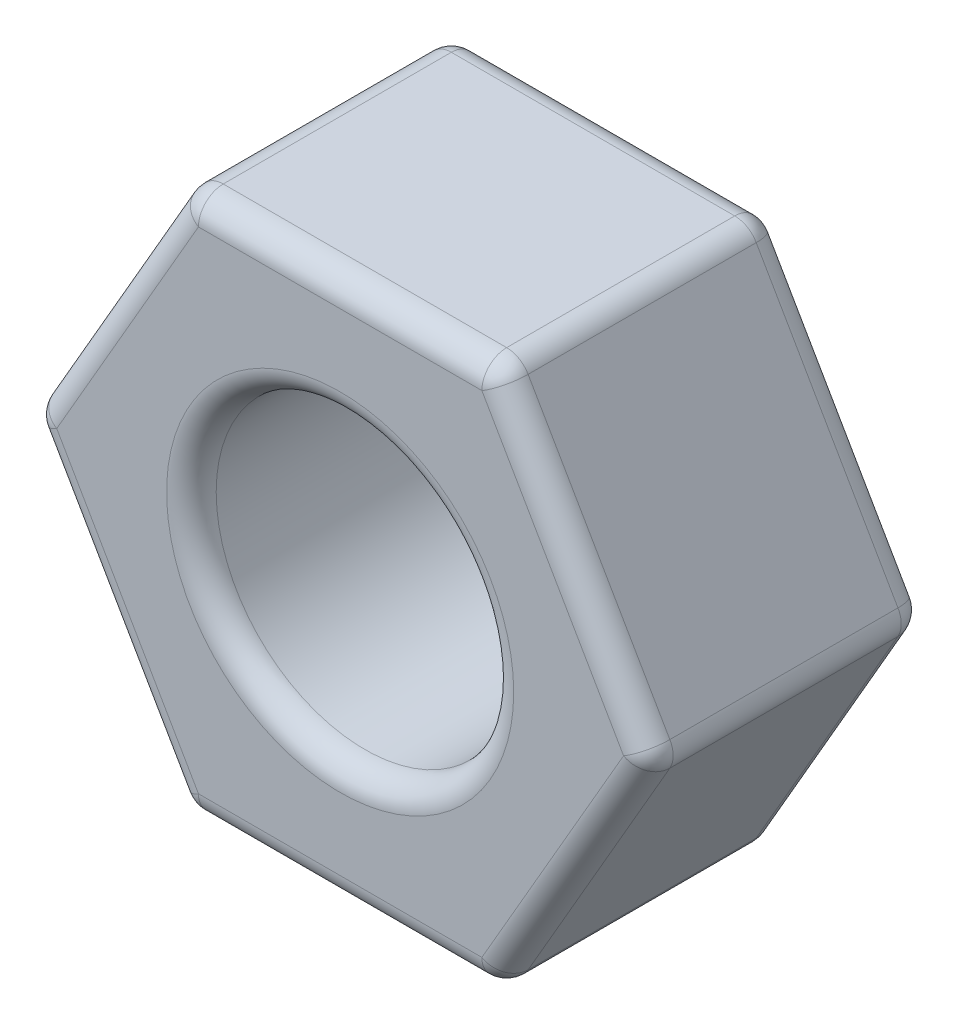
ISO-10303-21;
HEADER;
FILE_DESCRIPTION(('STEP AP214'),'2;1');
FILE_NAME('part.step','',(''),(''),'','','');
FILE_SCHEMA(('AUTOMOTIVE_DESIGN { 1 0 10303 214 1 1 1 1 }'));
ENDSEC;
DATA;
#1=APPLICATION_CONTEXT('core data for automotive mechanical design processes');
#2=APPLICATION_PROTOCOL_DEFINITION('international standard','automotive_design',2000,#1);
#3=PRODUCT_CONTEXT('',#1,'mechanical');
#4=PRODUCT('Part','Part','',(#3));
#5=PRODUCT_RELATED_PRODUCT_CATEGORY('part','',(#4));
#6=PRODUCT_DEFINITION_FORMATION('','',#4);
#7=PRODUCT_DEFINITION_CONTEXT('part definition',#1,'design');
#8=PRODUCT_DEFINITION('design','',#6,#7);
#9=PRODUCT_DEFINITION_SHAPE('','',#8);
#10=(LENGTH_UNIT() NAMED_UNIT(*) SI_UNIT(.MILLI.,.METRE.));
#11=(NAMED_UNIT(*) PLANE_ANGLE_UNIT() SI_UNIT($,.RADIAN.));
#12=(NAMED_UNIT(*) SI_UNIT($,.STERADIAN.) SOLID_ANGLE_UNIT());
#13=UNCERTAINTY_MEASURE_WITH_UNIT(LENGTH_MEASURE(1.E-05),#10,'distance_accuracy_value','');
#14=(GEOMETRIC_REPRESENTATION_CONTEXT(3) GLOBAL_UNCERTAINTY_ASSIGNED_CONTEXT((#13)) GLOBAL_UNIT_ASSIGNED_CONTEXT((#10,
#11,#12)) REPRESENTATION_CONTEXT('',''));
#15=CARTESIAN_POINT('',(0.,0.,0.));
#16=DIRECTION('',(0.,0.,1.));
#17=DIRECTION('',(1.,0.,0.));
#18=AXIS2_PLACEMENT_3D('',#15,#16,#17);
#19=CARTESIAN_POINT('',(0.,0.,5.6));
#20=DIRECTION('',(0.,0.,1.));
#21=DIRECTION('',(1.,0.,0.));
#22=AXIS2_PLACEMENT_3D('',#19,#20,#21);
#23=PLANE('',#22);
#24=CARTESIAN_POINT('',(0.,0.,5.6));
#25=DIRECTION('',(0.,0.,1.));
#26=DIRECTION('',(1.,0.,0.));
#27=AXIS2_PLACEMENT_3D('',#24,#25,#26);
#28=CIRCLE('',#27,3.5);
#29=CARTESIAN_POINT('',(3.5,0.,5.6));
#30=VERTEX_POINT('',#29);
#31=EDGE_CURVE('E11',#30,#30,#28,.F.);
#32=ORIENTED_EDGE('',*,*,#31,.T.);
#33=EDGE_LOOP('',(#32));
#34=FACE_BOUND('',#33,.T.);
#35=DIRECTION('',(-0.5,0.866025403784439,0.));
#36=VECTOR('',#35,1.);
#37=CARTESIAN_POINT('',(2.71354626519124,5.2,5.6));
#38=LINE('',#37,#36);
#39=CARTESIAN_POINT('',(5.71576766497729,0.,5.6));
#40=VERTEX_POINT('',#39);
#41=CARTESIAN_POINT('',(2.85788383248865,4.95,5.6));
#42=VERTEX_POINT('',#41);
#43=EDGE_CURVE('E60',#40,#42,#38,.T.);
#44=ORIENTED_EDGE('',*,*,#43,.T.);
#45=DIRECTION('',(-1.,0.,0.));
#46=VECTOR('',#45,1.);
#47=CARTESIAN_POINT('',(-3.14655896708346,4.95,5.6));
#48=LINE('',#47,#46);
#49=CARTESIAN_POINT('',(-2.85788383248865,4.95,5.6));
#50=VERTEX_POINT('',#49);
#51=EDGE_CURVE('E52',#42,#50,#48,.T.);
#52=ORIENTED_EDGE('',*,*,#51,.T.);
#53=DIRECTION('',(-0.5,-0.866025403784439,0.));
#54=VECTOR('',#53,1.);
#55=CARTESIAN_POINT('',(-5.8601052322747,-0.250000000000001,5.6));
#56=LINE('',#55,#54);
#57=CARTESIAN_POINT('',(-5.7157676649773,0.,5.6));
#58=VERTEX_POINT('',#57);
#59=EDGE_CURVE('E277',#50,#58,#56,.T.);
#60=ORIENTED_EDGE('',*,*,#59,.T.);
#61=DIRECTION('',(0.5,-0.866025403784439,0.));
#62=VECTOR('',#61,1.);
#63=CARTESIAN_POINT('',(-2.71354626519124,-5.2,5.6));
#64=LINE('',#63,#62);
#65=CARTESIAN_POINT('',(-2.85788383248865,-4.95,5.6));
#66=VERTEX_POINT('',#65);
#67=EDGE_CURVE('E279',#58,#66,#64,.T.);
#68=ORIENTED_EDGE('',*,*,#67,.T.);
#69=DIRECTION('',(1.,0.,0.));
#70=VECTOR('',#69,1.);
#71=CARTESIAN_POINT('',(3.14655896708346,-4.95,5.6));
#72=LINE('',#71,#70);
#73=CARTESIAN_POINT('',(2.85788383248865,-4.95,5.6));
#74=VERTEX_POINT('',#73);
#75=EDGE_CURVE('E281',#66,#74,#72,.T.);
#76=ORIENTED_EDGE('',*,*,#75,.T.);
#77=DIRECTION('',(0.5,0.866025403784439,0.));
#78=VECTOR('',#77,1.);
#79=CARTESIAN_POINT('',(5.8601052322747,0.250000000000002,5.6));
#80=LINE('',#79,#78);
#81=EDGE_CURVE('E65',#74,#40,#80,.T.);
#82=ORIENTED_EDGE('',*,*,#81,.T.);
#83=EDGE_LOOP('',(#44,#52,#60,#68,#76,#82));
#84=FACE_BOUND('',#83,.T.);
#85=ADVANCED_FACE('F43',(#34,#84),#23,.T.);
#86=CARTESIAN_POINT('',(0.,0.,0.));
#87=DIRECTION('',(0.,0.,1.));
#88=DIRECTION('',(1.,0.,0.));
#89=AXIS2_PLACEMENT_3D('',#86,#87,#88);
#90=PLANE('',#89);
#91=CARTESIAN_POINT('',(0.,0.,0.));
#92=DIRECTION('',(0.,0.,1.));
#93=DIRECTION('',(1.,0.,0.));
#94=AXIS2_PLACEMENT_3D('',#91,#92,#93);
#95=CIRCLE('',#94,3.5);
#96=CARTESIAN_POINT('',(3.5,0.,0.));
#97=VERTEX_POINT('',#96);
#98=EDGE_CURVE('E215',#97,#97,#95,.T.);
#99=ORIENTED_EDGE('',*,*,#98,.T.);
#100=EDGE_LOOP('',(#99));
#101=FACE_BOUND('',#100,.T.);
#102=DIRECTION('',(-0.5,0.866025403784439,0.));
#103=VECTOR('',#102,1.);
#104=CARTESIAN_POINT('',(4.28682574873297,2.475,0.));
#105=LINE('',#104,#103);
#106=CARTESIAN_POINT('',(2.85788383248865,4.95,0.));
#107=VERTEX_POINT('',#106);
#108=CARTESIAN_POINT('',(5.71576766497729,0.,0.));
#109=VERTEX_POINT('',#108);
#110=EDGE_CURVE('E179',#107,#109,#105,.F.);
#111=ORIENTED_EDGE('',*,*,#110,.T.);
#112=DIRECTION('',(0.5,0.866025403784439,0.));
#113=VECTOR('',#112,1.);
#114=CARTESIAN_POINT('',(4.28682574873297,-2.475,0.));
#115=LINE('',#114,#113);
#116=CARTESIAN_POINT('',(2.85788383248865,-4.95,0.));
#117=VERTEX_POINT('',#116);
#118=EDGE_CURVE('E212',#109,#117,#115,.F.);
#119=ORIENTED_EDGE('',*,*,#118,.T.);
#120=DIRECTION('',(1.,0.,0.));
#121=VECTOR('',#120,1.);
#122=CARTESIAN_POINT('',(0.,-4.95,0.));
#123=LINE('',#122,#121);
#124=CARTESIAN_POINT('',(-2.85788383248865,-4.95,0.));
#125=VERTEX_POINT('',#124);
#126=EDGE_CURVE('E210',#117,#125,#123,.F.);
#127=ORIENTED_EDGE('',*,*,#126,.T.);
#128=DIRECTION('',(0.5,-0.866025403784439,0.));
#129=VECTOR('',#128,1.);
#130=CARTESIAN_POINT('',(-4.28682574873297,-2.475,0.));
#131=LINE('',#130,#129);
#132=CARTESIAN_POINT('',(-5.71576766497729,0.,0.));
#133=VERTEX_POINT('',#132);
#134=EDGE_CURVE('E175',#125,#133,#131,.F.);
#135=ORIENTED_EDGE('',*,*,#134,.T.);
#136=DIRECTION('',(-0.5,-0.866025403784439,0.));
#137=VECTOR('',#136,1.);
#138=CARTESIAN_POINT('',(-4.28682574873297,2.475,0.));
#139=LINE('',#138,#137);
#140=CARTESIAN_POINT('',(-2.85788383248865,4.95,0.));
#141=VERTEX_POINT('',#140);
#142=EDGE_CURVE('E168',#133,#141,#139,.F.);
#143=ORIENTED_EDGE('',*,*,#142,.T.);
#144=DIRECTION('',(-1.,0.,0.));
#145=VECTOR('',#144,1.);
#146=CARTESIAN_POINT('',(0.,4.95,0.));
#147=LINE('',#146,#145);
#148=EDGE_CURVE('E172',#141,#107,#147,.F.);
#149=ORIENTED_EDGE('',*,*,#148,.T.);
#150=EDGE_LOOP('',(#111,#119,#127,#135,#143,#149));
#151=FACE_BOUND('',#150,.T.);
#152=ADVANCED_FACE('F170',(#101,#151),#90,.F.);
#153=CARTESIAN_POINT('',(-3.14655896708346,5.45,5.6));
#154=DIRECTION('',(0.866025403784439,-0.5,0.));
#155=DIRECTION('',(0.5,0.866025403784439,0.));
#156=AXIS2_PLACEMENT_3D('',#153,#154,#155);
#157=PLANE('',#156);
#158=DIRECTION('',(-0.5,-0.866025403784439,0.));
#159=VECTOR('',#158,1.);
#160=CARTESIAN_POINT('',(-3.14655896708346,5.45,0.5));
#161=LINE('',#160,#159);
#162=CARTESIAN_POINT('',(-3.29089653438087,5.2,0.5));
#163=VERTEX_POINT('',#162);
#164=CARTESIAN_POINT('',(-6.14878036686951,0.249999999999999,0.5));
#165=VERTEX_POINT('',#164);
#166=EDGE_CURVE('E186',#163,#165,#161,.T.);
#167=ORIENTED_EDGE('',*,*,#166,.T.);
#168=DIRECTION('',(0.,0.,-1.));
#169=VECTOR('',#168,1.);
#170=CARTESIAN_POINT('',(-6.14878036686951,0.249999999999999,5.6));
#171=LINE('',#170,#169);
#172=CARTESIAN_POINT('',(-6.14878036686951,0.249999999999999,5.1));
#173=VERTEX_POINT('',#172);
#174=EDGE_CURVE('E256',#165,#173,#171,.F.);
#175=ORIENTED_EDGE('',*,*,#174,.T.);
#176=DIRECTION('',(-0.5,-0.866025403784439,0.));
#177=VECTOR('',#176,1.);
#178=CARTESIAN_POINT('',(-3.14655896708346,5.45,5.1));
#179=LINE('',#178,#177);
#180=CARTESIAN_POINT('',(-3.29089653438087,5.2,5.1));
#181=VERTEX_POINT('',#180);
#182=EDGE_CURVE('E251',#173,#181,#179,.F.);
#183=ORIENTED_EDGE('',*,*,#182,.T.);
#184=DIRECTION('',(0.,0.,-1.));
#185=VECTOR('',#184,1.);
#186=CARTESIAN_POINT('',(-3.29089653438087,5.2,5.6));
#187=LINE('',#186,#185);
#188=EDGE_CURVE('E253',#181,#163,#187,.T.);
#189=ORIENTED_EDGE('',*,*,#188,.T.);
#190=EDGE_LOOP('',(#167,#175,#183,#189));
#191=FACE_BOUND('',#190,.T.);
#192=ADVANCED_FACE('F408',(#191),#157,.F.);
#193=CARTESIAN_POINT('',(-6.29311793416692,0.,5.6));
#194=DIRECTION('',(0.866025403784439,0.5,0.));
#195=DIRECTION('',(-0.5,0.866025403784439,0.));
#196=AXIS2_PLACEMENT_3D('',#193,#194,#195);
#197=PLANE('',#196);
#198=DIRECTION('',(0.5,-0.866025403784439,0.));
#199=VECTOR('',#198,1.);
#200=CARTESIAN_POINT('',(-6.29311793416692,0.,0.5));
#201=LINE('',#200,#199);
#202=CARTESIAN_POINT('',(-6.14878036686951,-0.250000000000001,0.5));
#203=VERTEX_POINT('',#202);
#204=CARTESIAN_POINT('',(-3.29089653438086,-5.2,0.5));
#205=VERTEX_POINT('',#204);
#206=EDGE_CURVE('E246',#203,#205,#201,.T.);
#207=ORIENTED_EDGE('',*,*,#206,.T.);
#208=DIRECTION('',(0.,0.,-1.));
#209=VECTOR('',#208,1.);
#210=CARTESIAN_POINT('',(-3.29089653438086,-5.2,5.6));
#211=LINE('',#210,#209);
#212=CARTESIAN_POINT('',(-3.29089653438086,-5.2,5.1));
#213=VERTEX_POINT('',#212);
#214=EDGE_CURVE('E248',#205,#213,#211,.F.);
#215=ORIENTED_EDGE('',*,*,#214,.T.);
#216=DIRECTION('',(0.5,-0.866025403784439,0.));
#217=VECTOR('',#216,1.);
#218=CARTESIAN_POINT('',(-6.29311793416692,0.,5.1));
#219=LINE('',#218,#217);
#220=CARTESIAN_POINT('',(-6.14878036686951,-0.250000000000001,5.1));
#221=VERTEX_POINT('',#220);
#222=EDGE_CURVE('E242',#213,#221,#219,.F.);
#223=ORIENTED_EDGE('',*,*,#222,.T.);
#224=DIRECTION('',(0.,0.,-1.));
#225=VECTOR('',#224,1.);
#226=CARTESIAN_POINT('',(-6.14878036686951,-0.250000000000001,5.6));
#227=LINE('',#226,#225);
#228=EDGE_CURVE('E244',#221,#203,#227,.T.);
#229=ORIENTED_EDGE('',*,*,#228,.T.);
#230=EDGE_LOOP('',(#207,#215,#223,#229));
#231=FACE_BOUND('',#230,.T.);
#232=ADVANCED_FACE('F424',(#231),#197,.F.);
#233=CARTESIAN_POINT('',(-3.14655896708346,-5.45,5.6));
#234=DIRECTION('',(0.,1.,0.));
#235=DIRECTION('',(0.,0.,1.));
#236=AXIS2_PLACEMENT_3D('',#233,#234,#235);
#237=PLANE('',#236);
#238=DIRECTION('',(1.,0.,0.));
#239=VECTOR('',#238,1.);
#240=CARTESIAN_POINT('',(-3.14655896708346,-5.45,0.5));
#241=LINE('',#240,#239);
#242=CARTESIAN_POINT('',(-2.85788383248865,-5.45,0.5));
#243=VERTEX_POINT('',#242);
#244=CARTESIAN_POINT('',(2.85788383248865,-5.45,0.5));
#245=VERTEX_POINT('',#244);
#246=EDGE_CURVE('E237',#243,#245,#241,.T.);
#247=ORIENTED_EDGE('',*,*,#246,.T.);
#248=DIRECTION('',(0.,0.,-1.));
#249=VECTOR('',#248,1.);
#250=CARTESIAN_POINT('',(2.85788383248865,-5.45,5.6));
#251=LINE('',#250,#249);
#252=CARTESIAN_POINT('',(2.85788383248865,-5.45,5.1));
#253=VERTEX_POINT('',#252);
#254=EDGE_CURVE('E239',#245,#253,#251,.F.);
#255=ORIENTED_EDGE('',*,*,#254,.T.);
#256=DIRECTION('',(1.,0.,0.));
#257=VECTOR('',#256,1.);
#258=CARTESIAN_POINT('',(-3.14655896708346,-5.45,5.1));
#259=LINE('',#258,#257);
#260=CARTESIAN_POINT('',(-2.85788383248865,-5.45,5.1));
#261=VERTEX_POINT('',#260);
#262=EDGE_CURVE('E233',#253,#261,#259,.F.);
#263=ORIENTED_EDGE('',*,*,#262,.T.);
#264=DIRECTION('',(0.,0.,-1.));
#265=VECTOR('',#264,1.);
#266=CARTESIAN_POINT('',(-2.85788383248865,-5.45,5.6));
#267=LINE('',#266,#265);
#268=EDGE_CURVE('E235',#261,#243,#267,.T.);
#269=ORIENTED_EDGE('',*,*,#268,.T.);
#270=EDGE_LOOP('',(#247,#255,#263,#269));
#271=FACE_BOUND('',#270,.T.);
#272=ADVANCED_FACE('F468',(#271),#237,.F.);
#273=CARTESIAN_POINT('',(3.14655896708346,-5.45,5.6));
#274=DIRECTION('',(-0.866025403784439,0.5,0.));
#275=DIRECTION('',(-0.5,-0.866025403784439,0.));
#276=AXIS2_PLACEMENT_3D('',#273,#274,#275);
#277=PLANE('',#276);
#278=DIRECTION('',(0.,0.,-1.));
#279=VECTOR('',#278,1.);
#280=CARTESIAN_POINT('',(3.29089653438087,-5.2,5.6));
#281=LINE('',#280,#279);
#282=CARTESIAN_POINT('',(3.29089653438087,-5.2,5.1));
#283=VERTEX_POINT('',#282);
#284=CARTESIAN_POINT('',(3.29089653438087,-5.2,0.5));
#285=VERTEX_POINT('',#284);
#286=EDGE_CURVE('E228',#283,#285,#281,.T.);
#287=ORIENTED_EDGE('',*,*,#286,.T.);
#288=DIRECTION('',(0.5,0.866025403784439,0.));
#289=VECTOR('',#288,1.);
#290=CARTESIAN_POINT('',(3.14655896708346,-5.45,0.5));
#291=LINE('',#290,#289);
#292=CARTESIAN_POINT('',(6.14878036686951,-0.249999999999998,0.5));
#293=VERTEX_POINT('',#292);
#294=EDGE_CURVE('E230',#285,#293,#291,.T.);
#295=ORIENTED_EDGE('',*,*,#294,.T.);
#296=DIRECTION('',(0.,0.,-1.));
#297=VECTOR('',#296,1.);
#298=CARTESIAN_POINT('',(6.14878036686951,-0.249999999999999,5.6));
#299=LINE('',#298,#297);
#300=CARTESIAN_POINT('',(6.14878036686951,-0.249999999999998,5.1));
#301=VERTEX_POINT('',#300);
#302=EDGE_CURVE('E226',#293,#301,#299,.F.);
#303=ORIENTED_EDGE('',*,*,#302,.T.);
#304=DIRECTION('',(0.5,0.866025403784439,0.));
#305=VECTOR('',#304,1.);
#306=CARTESIAN_POINT('',(3.14655896708346,-5.45,5.1));
#307=LINE('',#306,#305);
#308=EDGE_CURVE('E224',#301,#283,#307,.F.);
#309=ORIENTED_EDGE('',*,*,#308,.T.);
#310=EDGE_LOOP('',(#287,#295,#303,#309));
#311=FACE_BOUND('',#310,.T.);
#312=ADVANCED_FACE('F465',(#311),#277,.F.);
#313=CARTESIAN_POINT('',(6.29311793416692,0.,5.6));
#314=DIRECTION('',(-0.866025403784439,-0.5,0.));
#315=DIRECTION('',(0.5,-0.866025403784439,0.));
#316=AXIS2_PLACEMENT_3D('',#313,#314,#315);
#317=PLANE('',#316);
#318=DIRECTION('',(-0.5,0.866025403784439,0.));
#319=VECTOR('',#318,1.);
#320=CARTESIAN_POINT('',(6.29311793416692,0.,5.1));
#321=LINE('',#320,#319);
#322=CARTESIAN_POINT('',(3.29089653438087,5.2,5.1));
#323=VERTEX_POINT('',#322);
#324=CARTESIAN_POINT('',(6.14878036686951,0.250000000000002,5.1));
#325=VERTEX_POINT('',#324);
#326=EDGE_CURVE('E259',#323,#325,#321,.F.);
#327=ORIENTED_EDGE('',*,*,#326,.T.);
#328=DIRECTION('',(0.,0.,-1.));
#329=VECTOR('',#328,1.);
#330=CARTESIAN_POINT('',(6.14878036686951,0.250000000000002,5.6));
#331=LINE('',#330,#329);
#332=CARTESIAN_POINT('',(6.14878036686951,0.250000000000002,0.5));
#333=VERTEX_POINT('',#332);
#334=EDGE_CURVE('E265',#325,#333,#331,.T.);
#335=ORIENTED_EDGE('',*,*,#334,.T.);
#336=DIRECTION('',(-0.5,0.866025403784439,0.));
#337=VECTOR('',#336,1.);
#338=CARTESIAN_POINT('',(6.29311793416692,0.,0.5));
#339=LINE('',#338,#337);
#340=CARTESIAN_POINT('',(3.29089653438087,5.2,0.5));
#341=VERTEX_POINT('',#340);
#342=EDGE_CURVE('E263',#333,#341,#339,.T.);
#343=ORIENTED_EDGE('',*,*,#342,.T.);
#344=DIRECTION('',(0.,0.,-1.));
#345=VECTOR('',#344,1.);
#346=CARTESIAN_POINT('',(3.29089653438087,5.2,5.6));
#347=LINE('',#346,#345);
#348=EDGE_CURVE('E261',#341,#323,#347,.F.);
#349=ORIENTED_EDGE('',*,*,#348,.T.);
#350=EDGE_LOOP('',(#327,#335,#343,#349));
#351=FACE_BOUND('',#350,.T.);
#352=ADVANCED_FACE('F395',(#351),#317,.F.);
#353=CARTESIAN_POINT('',(3.14655896708346,5.45,5.6));
#354=DIRECTION('',(0.,-1.,0.));
#355=DIRECTION('',(1.,0.,0.));
#356=AXIS2_PLACEMENT_3D('',#353,#354,#355);
#357=PLANE('',#356);
#358=DIRECTION('',(0.,0.,-1.));
#359=VECTOR('',#358,1.);
#360=CARTESIAN_POINT('',(2.85788383248865,5.45,5.6));
#361=LINE('',#360,#359);
#362=CARTESIAN_POINT('',(2.85788383248865,5.45,5.1));
#363=VERTEX_POINT('',#362);
#364=CARTESIAN_POINT('',(2.85788383248865,5.45,0.5));
#365=VERTEX_POINT('',#364);
#366=EDGE_CURVE('E272',#363,#365,#361,.T.);
#367=ORIENTED_EDGE('',*,*,#366,.T.);
#368=DIRECTION('',(-1.,0.,0.));
#369=VECTOR('',#368,1.);
#370=CARTESIAN_POINT('',(3.14655896708346,5.45,0.5));
#371=LINE('',#370,#369);
#372=CARTESIAN_POINT('',(-2.85788383248865,5.45,0.5));
#373=VERTEX_POINT('',#372);
#374=EDGE_CURVE('E275',#365,#373,#371,.T.);
#375=ORIENTED_EDGE('',*,*,#374,.T.);
#376=DIRECTION('',(0.,0.,-1.));
#377=VECTOR('',#376,1.);
#378=CARTESIAN_POINT('',(-2.85788383248865,5.45,5.6));
#379=LINE('',#378,#377);
#380=CARTESIAN_POINT('',(-2.85788383248865,5.45,5.1));
#381=VERTEX_POINT('',#380);
#382=EDGE_CURVE('E270',#373,#381,#379,.F.);
#383=ORIENTED_EDGE('',*,*,#382,.T.);
#384=DIRECTION('',(-1.,0.,0.));
#385=VECTOR('',#384,1.);
#386=CARTESIAN_POINT('',(3.14655896708346,5.45,5.1));
#387=LINE('',#386,#385);
#388=EDGE_CURVE('E268',#381,#363,#387,.F.);
#389=ORIENTED_EDGE('',*,*,#388,.T.);
#390=EDGE_LOOP('',(#367,#375,#383,#389));
#391=FACE_BOUND('',#390,.T.);
#392=ADVANCED_FACE('F403',(#391),#357,.F.);
#393=CARTESIAN_POINT('',(0.,0.,5.6));
#394=DIRECTION('',(0.,0.,-1.));
#395=DIRECTION('',(-1.,0.,0.));
#396=AXIS2_PLACEMENT_3D('',#393,#394,#395);
#397=CYLINDRICAL_SURFACE('',#396,3.);
#398=CARTESIAN_POINT('',(0.,0.,0.5));
#399=DIRECTION('',(0.,0.,1.));
#400=DIRECTION('',(1.,0.,0.));
#401=AXIS2_PLACEMENT_3D('',#398,#399,#400);
#402=CIRCLE('',#401,3.);
#403=CARTESIAN_POINT('',(3.,0.,0.5));
#404=VERTEX_POINT('',#403);
#405=EDGE_CURVE('E221',#404,#404,#402,.F.);
#406=ORIENTED_EDGE('',*,*,#405,.T.);
#407=EDGE_LOOP('',(#406));
#408=FACE_BOUND('',#407,.T.);
#409=CARTESIAN_POINT('',(0.,0.,5.1));
#410=DIRECTION('',(0.,0.,1.));
#411=DIRECTION('',(1.,0.,0.));
#412=AXIS2_PLACEMENT_3D('',#409,#410,#411);
#413=CIRCLE('',#412,3.);
#414=CARTESIAN_POINT('',(3.,0.,5.1));
#415=VERTEX_POINT('',#414);
#416=EDGE_CURVE('E218',#415,#415,#413,.T.);
#417=ORIENTED_EDGE('',*,*,#416,.T.);
#418=EDGE_LOOP('',(#417));
#419=FACE_BOUND('',#418,.T.);
#420=ADVANCED_FACE('F459',(#408,#419),#397,.F.);
#421=CARTESIAN_POINT('',(0.,0.,0.5));
#422=DIRECTION('',(0.,0.,1.));
#423=DIRECTION('',(1.,0.,0.));
#424=AXIS2_PLACEMENT_3D('',#421,#422,#423);
#425=TOROIDAL_SURFACE('',#424,3.5,0.5);
#426=ORIENTED_EDGE('',*,*,#405,.F.);
#427=EDGE_LOOP('',(#426));
#428=FACE_BOUND('',#427,.T.);
#429=ORIENTED_EDGE('',*,*,#98,.F.);
#430=EDGE_LOOP('',(#429));
#431=FACE_BOUND('',#430,.T.);
#432=ADVANCED_FACE('F449',(#428,#431),#425,.T.);
#433=CARTESIAN_POINT('',(-4.28682574873297,2.475,5.1));
#434=DIRECTION('',(0.5,0.866025403784439,0.));
#435=DIRECTION('',(-0.866025403784439,0.5,0.));
#436=AXIS2_PLACEMENT_3D('',#433,#434,#435);
#437=CYLINDRICAL_SURFACE('',#436,0.5);
#438=CARTESIAN_POINT('',(-5.7157676649773,0.,5.1));
#439=DIRECTION('',(-0.500000000000003,-0.866025403784437,0.));
#440=DIRECTION('',(0.866025403784437,-0.500000000000003,0.));
#441=AXIS2_PLACEMENT_3D('',#438,#439,#440);
#442=CIRCLE('',#441,0.5);
#443=EDGE_CURVE('E47',#58,#173,#442,.T.);
#444=ORIENTED_EDGE('',*,*,#443,.F.);
#445=ORIENTED_EDGE('',*,*,#59,.F.);
#446=CARTESIAN_POINT('',(-2.85788383248865,4.95,5.1));
#447=DIRECTION('',(0.5,0.866025403784438,0.));
#448=DIRECTION('',(-0.866025403784438,0.5,0.));
#449=AXIS2_PLACEMENT_3D('',#446,#447,#448);
#450=CIRCLE('',#449,0.5);
#451=EDGE_CURVE('E207',#181,#50,#450,.T.);
#452=ORIENTED_EDGE('',*,*,#451,.F.);
#453=ORIENTED_EDGE('',*,*,#182,.F.);
#454=EDGE_LOOP('',(#444,#445,#452,#453));
#455=FACE_BOUND('',#454,.T.);
#456=ADVANCED_FACE('F378',(#455),#437,.T.);
#457=CARTESIAN_POINT('',(-5.71576766497729,0.,5.1));
#458=DIRECTION('',(0.,0.,1.));
#459=DIRECTION('',(0.,-1.,0.));
#460=AXIS2_PLACEMENT_3D('',#457,#458,#459);
#461=SPHERICAL_SURFACE('',#460,0.5);
#462=CARTESIAN_POINT('',(-5.71576766497729,0.,5.1));
#463=DIRECTION('',(-0.5,0.866025403784439,0.));
#464=DIRECTION('',(-0.866025403784439,-0.5,0.));
#465=AXIS2_PLACEMENT_3D('',#462,#463,#464);
#466=CIRCLE('',#465,0.5);
#467=EDGE_CURVE('E362',#58,#221,#466,.F.);
#468=ORIENTED_EDGE('',*,*,#467,.F.);
#469=ORIENTED_EDGE('',*,*,#443,.T.);
#470=CARTESIAN_POINT('',(-5.71576766497729,0.,5.1));
#471=DIRECTION('',(0.,0.,1.));
#472=DIRECTION('',(1.,0.,0.));
#473=AXIS2_PLACEMENT_3D('',#470,#471,#472);
#474=CIRCLE('',#473,0.5);
#475=EDGE_CURVE('E365',#221,#173,#474,.F.);
#476=ORIENTED_EDGE('',*,*,#475,.F.);
#477=EDGE_LOOP('',(#468,#469,#476));
#478=FACE_BOUND('',#477,.T.);
#479=ADVANCED_FACE('F441',(#478),#461,.T.);
#480=CARTESIAN_POINT('',(-2.85788383248865,4.95,5.1));
#481=DIRECTION('',(0.,0.,1.));
#482=DIRECTION('',(1.,0.,0.));
#483=AXIS2_PLACEMENT_3D('',#480,#481,#482);
#484=SPHERICAL_SURFACE('',#483,0.5);
#485=CARTESIAN_POINT('',(-2.85788383248865,4.95,5.1));
#486=DIRECTION('',(0.,0.,1.));
#487=DIRECTION('',(1.,0.,0.));
#488=AXIS2_PLACEMENT_3D('',#485,#486,#487);
#489=CIRCLE('',#488,0.5);
#490=EDGE_CURVE('E357',#181,#381,#489,.F.);
#491=ORIENTED_EDGE('',*,*,#490,.F.);
#492=ORIENTED_EDGE('',*,*,#451,.T.);
#493=CARTESIAN_POINT('',(-2.85788383248865,4.95,5.1));
#494=DIRECTION('',(-1.,0.,0.));
#495=DIRECTION('',(0.,-1.,0.));
#496=AXIS2_PLACEMENT_3D('',#493,#494,#495);
#497=CIRCLE('',#496,0.5);
#498=EDGE_CURVE('E360',#381,#50,#497,.F.);
#499=ORIENTED_EDGE('',*,*,#498,.F.);
#500=EDGE_LOOP('',(#491,#492,#499));
#501=FACE_BOUND('',#500,.T.);
#502=ADVANCED_FACE('F372',(#501),#484,.T.);
#503=CARTESIAN_POINT('',(-5.71576766497729,0.,5.6));
#504=DIRECTION('',(0.,0.,-1.));
#505=DIRECTION('',(-1.,0.,0.));
#506=AXIS2_PLACEMENT_3D('',#503,#504,#505);
#507=CYLINDRICAL_SURFACE('',#506,0.5);
#508=ORIENTED_EDGE('',*,*,#475,.T.);
#509=ORIENTED_EDGE('',*,*,#174,.F.);
#510=CARTESIAN_POINT('',(-5.71576766497729,0.,0.5));
#511=DIRECTION('',(0.,0.,-1.));
#512=DIRECTION('',(-1.,0.,0.));
#513=AXIS2_PLACEMENT_3D('',#510,#511,#512);
#514=CIRCLE('',#513,0.5);
#515=EDGE_CURVE('E352',#203,#165,#514,.T.);
#516=ORIENTED_EDGE('',*,*,#515,.F.);
#517=ORIENTED_EDGE('',*,*,#228,.F.);
#518=EDGE_LOOP('',(#508,#509,#516,#517));
#519=FACE_BOUND('',#518,.T.);
#520=ADVANCED_FACE('F412',(#519),#507,.T.);
#521=CARTESIAN_POINT('',(-4.28682574873297,-2.475,5.1));
#522=DIRECTION('',(-0.5,0.866025403784439,0.));
#523=DIRECTION('',(-0.866025403784439,-0.5,0.));
#524=AXIS2_PLACEMENT_3D('',#521,#522,#523);
#525=CYLINDRICAL_SURFACE('',#524,0.5);
#526=ORIENTED_EDGE('',*,*,#467,.T.);
#527=ORIENTED_EDGE('',*,*,#222,.F.);
#528=CARTESIAN_POINT('',(-2.85788383248865,-4.95,5.1));
#529=DIRECTION('',(0.500000000000001,-0.866025403784438,0.));
#530=DIRECTION('',(0.866025403784438,0.500000000000001,0.));
#531=AXIS2_PLACEMENT_3D('',#528,#529,#530);
#532=CIRCLE('',#531,0.5);
#533=EDGE_CURVE('E349',#66,#213,#532,.T.);
#534=ORIENTED_EDGE('',*,*,#533,.F.);
#535=ORIENTED_EDGE('',*,*,#67,.F.);
#536=EDGE_LOOP('',(#526,#527,#534,#535));
#537=FACE_BOUND('',#536,.T.);
#538=ADVANCED_FACE('F439',(#537),#525,.T.);
#539=CARTESIAN_POINT('',(0.,4.95,5.1));
#540=DIRECTION('',(1.,0.,0.));
#541=DIRECTION('',(0.,1.,0.));
#542=AXIS2_PLACEMENT_3D('',#539,#540,#541);
#543=CYLINDRICAL_SURFACE('',#542,0.5);
#544=ORIENTED_EDGE('',*,*,#498,.T.);
#545=ORIENTED_EDGE('',*,*,#51,.F.);
#546=CARTESIAN_POINT('',(2.85788383248865,4.95,5.1));
#547=DIRECTION('',(1.,0.,0.));
#548=DIRECTION('',(0.,0.,-1.));
#549=AXIS2_PLACEMENT_3D('',#546,#547,#548);
#550=CIRCLE('',#549,0.5);
#551=EDGE_CURVE('E346',#363,#42,#550,.T.);
#552=ORIENTED_EDGE('',*,*,#551,.F.);
#553=ORIENTED_EDGE('',*,*,#388,.F.);
#554=EDGE_LOOP('',(#544,#545,#552,#553));
#555=FACE_BOUND('',#554,.T.);
#556=ADVANCED_FACE('F382',(#555),#543,.T.);
#557=CARTESIAN_POINT('',(-2.85788383248865,4.95,5.6));
#558=DIRECTION('',(0.,0.,-1.));
#559=DIRECTION('',(-1.,0.,0.));
#560=AXIS2_PLACEMENT_3D('',#557,#558,#559);
#561=CYLINDRICAL_SURFACE('',#560,0.5);
#562=ORIENTED_EDGE('',*,*,#490,.T.);
#563=ORIENTED_EDGE('',*,*,#382,.F.);
#564=CARTESIAN_POINT('',(-2.85788383248865,4.95,0.5));
#565=DIRECTION('',(0.,0.,-1.));
#566=DIRECTION('',(-1.,0.,0.));
#567=AXIS2_PLACEMENT_3D('',#564,#565,#566);
#568=CIRCLE('',#567,0.5);
#569=EDGE_CURVE('E190',#163,#373,#568,.T.);
#570=ORIENTED_EDGE('',*,*,#569,.F.);
#571=ORIENTED_EDGE('',*,*,#188,.F.);
#572=EDGE_LOOP('',(#562,#563,#570,#571));
#573=FACE_BOUND('',#572,.T.);
#574=ADVANCED_FACE('F406',(#573),#561,.T.);
#575=CARTESIAN_POINT('',(-2.71354626519124,5.2,0.5));
#576=DIRECTION('',(-0.5,-0.866025403784439,0.));
#577=DIRECTION('',(0.866025403784439,-0.5,0.));
#578=AXIS2_PLACEMENT_3D('',#575,#576,#577);
#579=CYLINDRICAL_SURFACE('',#578,0.5);
#580=CARTESIAN_POINT('',(-5.71576766497729,0.,0.5));
#581=DIRECTION('',(-0.499999999999999,-0.866025403784439,0.));
#582=DIRECTION('',(0.866025403784439,-0.5,0.));
#583=AXIS2_PLACEMENT_3D('',#580,#581,#582);
#584=CIRCLE('',#583,0.5);
#585=EDGE_CURVE('E355',#165,#133,#584,.T.);
#586=ORIENTED_EDGE('',*,*,#585,.F.);
#587=ORIENTED_EDGE('',*,*,#166,.F.);
#588=CARTESIAN_POINT('',(-2.85788383248865,4.95,0.5));
#589=DIRECTION('',(0.5,0.866025403784438,0.));
#590=DIRECTION('',(-0.866025403784438,0.5,0.));
#591=AXIS2_PLACEMENT_3D('',#588,#589,#590);
#592=CIRCLE('',#591,0.5);
#593=EDGE_CURVE('E183',#141,#163,#592,.T.);
#594=ORIENTED_EDGE('',*,*,#593,.F.);
#595=ORIENTED_EDGE('',*,*,#142,.F.);
#596=EDGE_LOOP('',(#586,#587,#594,#595));
#597=FACE_BOUND('',#596,.T.);
#598=ADVANCED_FACE('F185',(#597),#579,.T.);
#599=CARTESIAN_POINT('',(-5.71576766497729,0.,0.5));
#600=DIRECTION('',(0.,0.,-1.));
#601=DIRECTION('',(0.,1.,0.));
#602=AXIS2_PLACEMENT_3D('',#599,#600,#601);
#603=SPHERICAL_SURFACE('',#602,0.5);
#604=ORIENTED_EDGE('',*,*,#515,.T.);
#605=ORIENTED_EDGE('',*,*,#585,.T.);
#606=CARTESIAN_POINT('',(-5.71576766497729,0.,0.5));
#607=DIRECTION('',(-0.500000000000001,0.866025403784438,0.));
#608=DIRECTION('',(-0.866025403784438,-0.500000000000001,0.));
#609=AXIS2_PLACEMENT_3D('',#606,#607,#608);
#610=CIRCLE('',#609,0.5);
#611=EDGE_CURVE('E191',#203,#133,#610,.F.);
#612=ORIENTED_EDGE('',*,*,#611,.F.);
#613=EDGE_LOOP('',(#604,#605,#612));
#614=FACE_BOUND('',#613,.T.);
#615=ADVANCED_FACE('F417',(#614),#603,.T.);
#616=CARTESIAN_POINT('',(-2.85788383248865,-4.95,5.1));
#617=DIRECTION('',(0.,0.,1.));
#618=DIRECTION('',(1.,0.,0.));
#619=AXIS2_PLACEMENT_3D('',#616,#617,#618);
#620=SPHERICAL_SURFACE('',#619,0.5);
#621=CARTESIAN_POINT('',(-2.85788383248865,-4.95,5.1));
#622=DIRECTION('',(-1.,0.,0.));
#623=DIRECTION('',(0.,0.,1.));
#624=AXIS2_PLACEMENT_3D('',#621,#622,#623);
#625=CIRCLE('',#624,0.5);
#626=EDGE_CURVE('E338',#66,#261,#625,.F.);
#627=ORIENTED_EDGE('',*,*,#626,.F.);
#628=ORIENTED_EDGE('',*,*,#533,.T.);
#629=CARTESIAN_POINT('',(-2.85788383248865,-4.95,5.1));
#630=DIRECTION('',(0.,0.,1.));
#631=DIRECTION('',(1.,0.,0.));
#632=AXIS2_PLACEMENT_3D('',#629,#630,#631);
#633=CIRCLE('',#632,0.5);
#634=EDGE_CURVE('E341',#261,#213,#633,.F.);
#635=ORIENTED_EDGE('',*,*,#634,.F.);
#636=EDGE_LOOP('',(#627,#628,#635));
#637=FACE_BOUND('',#636,.T.);
#638=ADVANCED_FACE('F435',(#637),#620,.T.);
#639=CARTESIAN_POINT('',(2.85788383248865,4.95,5.1));
#640=DIRECTION('',(0.,0.,1.));
#641=DIRECTION('',(1.,0.,0.));
#642=AXIS2_PLACEMENT_3D('',#639,#640,#641);
#643=SPHERICAL_SURFACE('',#642,0.5);
#644=CARTESIAN_POINT('',(2.85788383248865,4.95,5.1));
#645=DIRECTION('',(0.,0.,1.));
#646=DIRECTION('',(1.,0.,0.));
#647=AXIS2_PLACEMENT_3D('',#644,#645,#646);
#648=CIRCLE('',#647,0.5);
#649=EDGE_CURVE('E198',#363,#323,#648,.F.);
#650=ORIENTED_EDGE('',*,*,#649,.F.);
#651=ORIENTED_EDGE('',*,*,#551,.T.);
#652=CARTESIAN_POINT('',(2.85788383248865,4.95,5.1));
#653=DIRECTION('',(-0.5,0.866025403784438,0.));
#654=DIRECTION('',(-0.866025403784438,-0.5,0.));
#655=AXIS2_PLACEMENT_3D('',#652,#653,#654);
#656=CIRCLE('',#655,0.5);
#657=EDGE_CURVE('E335',#323,#42,#656,.F.);
#658=ORIENTED_EDGE('',*,*,#657,.F.);
#659=EDGE_LOOP('',(#650,#651,#658));
#660=FACE_BOUND('',#659,.T.);
#661=ADVANCED_FACE('F386',(#660),#643,.T.);
#662=CARTESIAN_POINT('',(-2.85788383248865,4.95,0.5));
#663=DIRECTION('',(0.,0.,-1.));
#664=DIRECTION('',(-1.,0.,0.));
#665=AXIS2_PLACEMENT_3D('',#662,#663,#664);
#666=SPHERICAL_SURFACE('',#665,0.5);
#667=ORIENTED_EDGE('',*,*,#593,.T.);
#668=ORIENTED_EDGE('',*,*,#569,.T.);
#669=CARTESIAN_POINT('',(-2.85788383248865,4.95,0.5));
#670=DIRECTION('',(-1.,0.,0.));
#671=DIRECTION('',(0.,0.,1.));
#672=AXIS2_PLACEMENT_3D('',#669,#670,#671);
#673=CIRCLE('',#672,0.5);
#674=EDGE_CURVE('E194',#141,#373,#673,.F.);
#675=ORIENTED_EDGE('',*,*,#674,.F.);
#676=EDGE_LOOP('',(#667,#668,#675));
#677=FACE_BOUND('',#676,.T.);
#678=ADVANCED_FACE('F195',(#677),#666,.T.);
#679=CARTESIAN_POINT('',(-5.8601052322747,0.249999999999999,0.5));
#680=DIRECTION('',(0.5,-0.866025403784439,0.));
#681=DIRECTION('',(0.866025403784439,0.5,0.));
#682=AXIS2_PLACEMENT_3D('',#679,#680,#681);
#683=CYLINDRICAL_SURFACE('',#682,0.5);
#684=ORIENTED_EDGE('',*,*,#611,.T.);
#685=ORIENTED_EDGE('',*,*,#134,.F.);
#686=CARTESIAN_POINT('',(-2.85788383248865,-4.95,0.5));
#687=DIRECTION('',(0.5,-0.866025403784438,0.));
#688=DIRECTION('',(0.866025403784438,0.5,0.));
#689=AXIS2_PLACEMENT_3D('',#686,#687,#688);
#690=CIRCLE('',#689,0.5);
#691=EDGE_CURVE('E199',#205,#125,#690,.T.);
#692=ORIENTED_EDGE('',*,*,#691,.F.);
#693=ORIENTED_EDGE('',*,*,#206,.F.);
#694=EDGE_LOOP('',(#684,#685,#692,#693));
#695=FACE_BOUND('',#694,.T.);
#696=ADVANCED_FACE('F421',(#695),#683,.T.);
#697=CARTESIAN_POINT('',(-2.85788383248865,-4.95,5.6));
#698=DIRECTION('',(0.,0.,-1.));
#699=DIRECTION('',(-1.,0.,0.));
#700=AXIS2_PLACEMENT_3D('',#697,#698,#699);
#701=CYLINDRICAL_SURFACE('',#700,0.5);
#702=ORIENTED_EDGE('',*,*,#634,.T.);
#703=ORIENTED_EDGE('',*,*,#214,.F.);
#704=CARTESIAN_POINT('',(-2.85788383248865,-4.95,0.5));
#705=DIRECTION('',(0.,0.,-1.));
#706=DIRECTION('',(-1.,0.,0.));
#707=AXIS2_PLACEMENT_3D('',#704,#705,#706);
#708=CIRCLE('',#707,0.5);
#709=EDGE_CURVE('E328',#243,#205,#708,.T.);
#710=ORIENTED_EDGE('',*,*,#709,.F.);
#711=ORIENTED_EDGE('',*,*,#268,.F.);
#712=EDGE_LOOP('',(#702,#703,#710,#711));
#713=FACE_BOUND('',#712,.T.);
#714=ADVANCED_FACE('F427',(#713),#701,.T.);
#715=CARTESIAN_POINT('',(0.,-4.95,5.1));
#716=DIRECTION('',(-1.,0.,0.));
#717=DIRECTION('',(0.,0.,1.));
#718=AXIS2_PLACEMENT_3D('',#715,#716,#717);
#719=CYLINDRICAL_SURFACE('',#718,0.5);
#720=ORIENTED_EDGE('',*,*,#626,.T.);
#721=ORIENTED_EDGE('',*,*,#262,.F.);
#722=CARTESIAN_POINT('',(2.85788383248865,-4.95,5.1));
#723=DIRECTION('',(1.,0.,0.));
#724=DIRECTION('',(0.,0.,-1.));
#725=AXIS2_PLACEMENT_3D('',#722,#723,#724);
#726=CIRCLE('',#725,0.5);
#727=EDGE_CURVE('E325',#74,#253,#726,.T.);
#728=ORIENTED_EDGE('',*,*,#727,.F.);
#729=ORIENTED_EDGE('',*,*,#75,.F.);
#730=EDGE_LOOP('',(#720,#721,#728,#729));
#731=FACE_BOUND('',#730,.T.);
#732=ADVANCED_FACE('F533',(#731),#719,.T.);
#733=CARTESIAN_POINT('',(4.28682574873297,-2.475,5.1));
#734=DIRECTION('',(-0.5,-0.866025403784439,0.));
#735=DIRECTION('',(0.866025403784439,-0.5,0.));
#736=AXIS2_PLACEMENT_3D('',#733,#734,#735);
#737=CYLINDRICAL_SURFACE('',#736,0.5);
#738=CARTESIAN_POINT('',(5.71576766497729,0.,5.1));
#739=DIRECTION('',(0.499999999999999,0.866025403784439,0.));
#740=DIRECTION('',(-0.866025403784439,0.5,0.));
#741=AXIS2_PLACEMENT_3D('',#738,#739,#740);
#742=CIRCLE('',#741,0.5);
#743=EDGE_CURVE('E319',#40,#301,#742,.T.);
#744=ORIENTED_EDGE('',*,*,#743,.F.);
#745=ORIENTED_EDGE('',*,*,#81,.F.);
#746=CARTESIAN_POINT('',(2.85788383248865,-4.95,5.1));
#747=DIRECTION('',(-0.5,-0.866025403784438,0.));
#748=DIRECTION('',(0.866025403784438,-0.5,0.));
#749=AXIS2_PLACEMENT_3D('',#746,#747,#748);
#750=CIRCLE('',#749,0.5);
#751=EDGE_CURVE('E322',#283,#74,#750,.T.);
#752=ORIENTED_EDGE('',*,*,#751,.F.);
#753=ORIENTED_EDGE('',*,*,#308,.F.);
#754=EDGE_LOOP('',(#744,#745,#752,#753));
#755=FACE_BOUND('',#754,.T.);
#756=ADVANCED_FACE('F530',(#755),#737,.T.);
#757=CARTESIAN_POINT('',(4.28682574873297,2.475,5.1));
#758=DIRECTION('',(0.5,-0.866025403784439,0.));
#759=DIRECTION('',(0.866025403784439,0.5,0.));
#760=AXIS2_PLACEMENT_3D('',#757,#758,#759);
#761=CYLINDRICAL_SURFACE('',#760,0.5);
#762=ORIENTED_EDGE('',*,*,#657,.T.);
#763=ORIENTED_EDGE('',*,*,#43,.F.);
#764=CARTESIAN_POINT('',(5.71576766497729,0.,5.1));
#765=DIRECTION('',(0.5,-0.866025403784439,0.));
#766=DIRECTION('',(0.866025403784439,0.5,0.));
#767=AXIS2_PLACEMENT_3D('',#764,#765,#766);
#768=CIRCLE('',#767,0.5);
#769=EDGE_CURVE('E316',#325,#40,#768,.T.);
#770=ORIENTED_EDGE('',*,*,#769,.F.);
#771=ORIENTED_EDGE('',*,*,#326,.F.);
#772=EDGE_LOOP('',(#762,#763,#770,#771));
#773=FACE_BOUND('',#772,.T.);
#774=ADVANCED_FACE('F390',(#773),#761,.T.);
#775=CARTESIAN_POINT('',(2.85788383248865,4.95,5.6));
#776=DIRECTION('',(0.,0.,-1.));
#777=DIRECTION('',(-1.,0.,0.));
#778=AXIS2_PLACEMENT_3D('',#775,#776,#777);
#779=CYLINDRICAL_SURFACE('',#778,0.5);
#780=ORIENTED_EDGE('',*,*,#649,.T.);
#781=ORIENTED_EDGE('',*,*,#348,.F.);
#782=CARTESIAN_POINT('',(2.85788383248865,4.95,0.5));
#783=DIRECTION('',(0.,0.,-1.));
#784=DIRECTION('',(-1.,0.,0.));
#785=AXIS2_PLACEMENT_3D('',#782,#783,#784);
#786=CIRCLE('',#785,0.5);
#787=EDGE_CURVE('E313',#365,#341,#786,.T.);
#788=ORIENTED_EDGE('',*,*,#787,.F.);
#789=ORIENTED_EDGE('',*,*,#366,.F.);
#790=EDGE_LOOP('',(#780,#781,#788,#789));
#791=FACE_BOUND('',#790,.T.);
#792=ADVANCED_FACE('F401',(#791),#779,.T.);
#793=CARTESIAN_POINT('',(3.14655896708346,4.95,0.5));
#794=DIRECTION('',(-1.,0.,0.));
#795=DIRECTION('',(0.,-1.,0.));
#796=AXIS2_PLACEMENT_3D('',#793,#794,#795);
#797=CYLINDRICAL_SURFACE('',#796,0.5);
#798=ORIENTED_EDGE('',*,*,#674,.T.);
#799=ORIENTED_EDGE('',*,*,#374,.F.);
#800=CARTESIAN_POINT('',(2.85788383248865,4.95,0.5));
#801=DIRECTION('',(1.,0.,0.));
#802=DIRECTION('',(0.,0.,-1.));
#803=AXIS2_PLACEMENT_3D('',#800,#801,#802);
#804=CIRCLE('',#803,0.5);
#805=EDGE_CURVE('E202',#107,#365,#804,.T.);
#806=ORIENTED_EDGE('',*,*,#805,.F.);
#807=ORIENTED_EDGE('',*,*,#148,.F.);
#808=EDGE_LOOP('',(#798,#799,#806,#807));
#809=FACE_BOUND('',#808,.T.);
#810=ADVANCED_FACE('F201',(#809),#797,.T.);
#811=CARTESIAN_POINT('',(-2.85788383248865,-4.95,0.5));
#812=DIRECTION('',(0.,0.,-1.));
#813=DIRECTION('',(-1.,0.,0.));
#814=AXIS2_PLACEMENT_3D('',#811,#812,#813);
#815=SPHERICAL_SURFACE('',#814,0.5);
#816=ORIENTED_EDGE('',*,*,#709,.T.);
#817=ORIENTED_EDGE('',*,*,#691,.T.);
#818=CARTESIAN_POINT('',(-2.85788383248865,-4.95,0.5));
#819=DIRECTION('',(-1.,0.,0.));
#820=DIRECTION('',(0.,0.,1.));
#821=AXIS2_PLACEMENT_3D('',#818,#819,#820);
#822=CIRCLE('',#821,0.5);
#823=EDGE_CURVE('E309',#243,#125,#822,.F.);
#824=ORIENTED_EDGE('',*,*,#823,.F.);
#825=EDGE_LOOP('',(#816,#817,#824));
#826=FACE_BOUND('',#825,.T.);
#827=ADVANCED_FACE('F519',(#826),#815,.T.);
#828=CARTESIAN_POINT('',(2.85788383248865,-4.95,5.1));
#829=DIRECTION('',(0.,0.,1.));
#830=DIRECTION('',(1.,0.,0.));
#831=AXIS2_PLACEMENT_3D('',#828,#829,#830);
#832=SPHERICAL_SURFACE('',#831,0.5);
#833=ORIENTED_EDGE('',*,*,#751,.T.);
#834=ORIENTED_EDGE('',*,*,#727,.T.);
#835=CARTESIAN_POINT('',(2.85788383248865,-4.95,5.1));
#836=DIRECTION('',(0.,0.,1.));
#837=DIRECTION('',(1.,0.,0.));
#838=AXIS2_PLACEMENT_3D('',#835,#836,#837);
#839=CIRCLE('',#838,0.5);
#840=EDGE_CURVE('E307',#283,#253,#839,.F.);
#841=ORIENTED_EDGE('',*,*,#840,.F.);
#842=EDGE_LOOP('',(#833,#834,#841));
#843=FACE_BOUND('',#842,.T.);
#844=ADVANCED_FACE('F515',(#843),#832,.T.);
#845=CARTESIAN_POINT('',(5.7157676649773,0.,5.1));
#846=DIRECTION('',(0.,0.,1.));
#847=DIRECTION('',(1.,0.,0.));
#848=AXIS2_PLACEMENT_3D('',#845,#846,#847);
#849=SPHERICAL_SURFACE('',#848,0.5);
#850=ORIENTED_EDGE('',*,*,#769,.T.);
#851=ORIENTED_EDGE('',*,*,#743,.T.);
#852=CARTESIAN_POINT('',(5.71576766497729,0.,5.1));
#853=DIRECTION('',(0.,0.,1.));
#854=DIRECTION('',(1.,0.,0.));
#855=AXIS2_PLACEMENT_3D('',#852,#853,#854);
#856=CIRCLE('',#855,0.5);
#857=EDGE_CURVE('E304',#325,#301,#856,.F.);
#858=ORIENTED_EDGE('',*,*,#857,.F.);
#859=EDGE_LOOP('',(#850,#851,#858));
#860=FACE_BOUND('',#859,.T.);
#861=ADVANCED_FACE('F511',(#860),#849,.T.);
#862=CARTESIAN_POINT('',(2.85788383248865,4.95,0.5));
#863=DIRECTION('',(0.,0.,-1.));
#864=DIRECTION('',(-1.,0.,0.));
#865=AXIS2_PLACEMENT_3D('',#862,#863,#864);
#866=SPHERICAL_SURFACE('',#865,0.5);
#867=ORIENTED_EDGE('',*,*,#805,.T.);
#868=ORIENTED_EDGE('',*,*,#787,.T.);
#869=CARTESIAN_POINT('',(2.85788383248865,4.95,0.5));
#870=DIRECTION('',(-0.5,0.866025403784438,0.));
#871=DIRECTION('',(-0.866025403784438,-0.5,0.));
#872=AXIS2_PLACEMENT_3D('',#869,#870,#871);
#873=CIRCLE('',#872,0.5);
#874=EDGE_CURVE('E301',#107,#341,#873,.F.);
#875=ORIENTED_EDGE('',*,*,#874,.F.);
#876=EDGE_LOOP('',(#867,#868,#875));
#877=FACE_BOUND('',#876,.T.);
#878=ADVANCED_FACE('F507',(#877),#866,.T.);
#879=CARTESIAN_POINT('',(-3.14655896708346,-4.95,0.5));
#880=DIRECTION('',(1.,0.,0.));
#881=DIRECTION('',(0.,0.,-1.));
#882=AXIS2_PLACEMENT_3D('',#879,#880,#881);
#883=CYLINDRICAL_SURFACE('',#882,0.5);
#884=ORIENTED_EDGE('',*,*,#823,.T.);
#885=ORIENTED_EDGE('',*,*,#126,.F.);
#886=CARTESIAN_POINT('',(2.85788383248865,-4.95,0.5));
#887=DIRECTION('',(1.,0.,0.));
#888=DIRECTION('',(0.,0.,-1.));
#889=AXIS2_PLACEMENT_3D('',#886,#887,#888);
#890=CIRCLE('',#889,0.5);
#891=EDGE_CURVE('E298',#245,#117,#890,.T.);
#892=ORIENTED_EDGE('',*,*,#891,.F.);
#893=ORIENTED_EDGE('',*,*,#246,.F.);
#894=EDGE_LOOP('',(#884,#885,#892,#893));
#895=FACE_BOUND('',#894,.T.);
#896=ADVANCED_FACE('F503',(#895),#883,.T.);
#897=CARTESIAN_POINT('',(2.85788383248865,-4.95,5.6));
#898=DIRECTION('',(0.,0.,-1.));
#899=DIRECTION('',(-1.,0.,0.));
#900=AXIS2_PLACEMENT_3D('',#897,#898,#899);
#901=CYLINDRICAL_SURFACE('',#900,0.5);
#902=ORIENTED_EDGE('',*,*,#840,.T.);
#903=ORIENTED_EDGE('',*,*,#254,.F.);
#904=CARTESIAN_POINT('',(2.85788383248865,-4.95,0.5));
#905=DIRECTION('',(0.,0.,-1.));
#906=DIRECTION('',(-1.,0.,0.));
#907=AXIS2_PLACEMENT_3D('',#904,#905,#906);
#908=CIRCLE('',#907,0.5);
#909=EDGE_CURVE('E295',#285,#245,#908,.T.);
#910=ORIENTED_EDGE('',*,*,#909,.F.);
#911=ORIENTED_EDGE('',*,*,#286,.F.);
#912=EDGE_LOOP('',(#902,#903,#910,#911));
#913=FACE_BOUND('',#912,.T.);
#914=ADVANCED_FACE('F499',(#913),#901,.T.);
#915=CARTESIAN_POINT('',(5.71576766497729,0.,5.6));
#916=DIRECTION('',(0.,0.,-1.));
#917=DIRECTION('',(-1.,0.,0.));
#918=AXIS2_PLACEMENT_3D('',#915,#916,#917);
#919=CYLINDRICAL_SURFACE('',#918,0.5);
#920=ORIENTED_EDGE('',*,*,#857,.T.);
#921=ORIENTED_EDGE('',*,*,#302,.F.);
#922=CARTESIAN_POINT('',(5.71576766497729,0.,0.5));
#923=DIRECTION('',(0.,0.,-1.));
#924=DIRECTION('',(-1.,0.,0.));
#925=AXIS2_PLACEMENT_3D('',#922,#923,#924);
#926=CIRCLE('',#925,0.5);
#927=EDGE_CURVE('E292',#333,#293,#926,.T.);
#928=ORIENTED_EDGE('',*,*,#927,.F.);
#929=ORIENTED_EDGE('',*,*,#334,.F.);
#930=EDGE_LOOP('',(#920,#921,#928,#929));
#931=FACE_BOUND('',#930,.T.);
#932=ADVANCED_FACE('F495',(#931),#919,.T.);
#933=CARTESIAN_POINT('',(5.8601052322747,-0.249999999999998,0.5));
#934=DIRECTION('',(-0.5,0.866025403784439,0.));
#935=DIRECTION('',(-0.866025403784439,-0.5,0.));
#936=AXIS2_PLACEMENT_3D('',#933,#934,#935);
#937=CYLINDRICAL_SURFACE('',#936,0.5);
#938=ORIENTED_EDGE('',*,*,#874,.T.);
#939=ORIENTED_EDGE('',*,*,#342,.F.);
#940=CARTESIAN_POINT('',(5.71576766497729,0.,0.5));
#941=DIRECTION('',(0.5,-0.866025403784439,0.));
#942=DIRECTION('',(0.866025403784439,0.5,0.));
#943=AXIS2_PLACEMENT_3D('',#940,#941,#942);
#944=CIRCLE('',#943,0.5);
#945=EDGE_CURVE('E290',#109,#333,#944,.T.);
#946=ORIENTED_EDGE('',*,*,#945,.F.);
#947=ORIENTED_EDGE('',*,*,#110,.F.);
#948=EDGE_LOOP('',(#938,#939,#946,#947));
#949=FACE_BOUND('',#948,.T.);
#950=ADVANCED_FACE('F491',(#949),#937,.T.);
#951=CARTESIAN_POINT('',(2.85788383248865,-4.95,0.5));
#952=DIRECTION('',(0.,0.,-1.));
#953=DIRECTION('',(-1.,0.,0.));
#954=AXIS2_PLACEMENT_3D('',#951,#952,#953);
#955=SPHERICAL_SURFACE('',#954,0.5);
#956=ORIENTED_EDGE('',*,*,#909,.T.);
#957=ORIENTED_EDGE('',*,*,#891,.T.);
#958=CARTESIAN_POINT('',(2.85788383248865,-4.95,0.5));
#959=DIRECTION('',(-0.5,-0.866025403784438,0.));
#960=DIRECTION('',(0.866025403784438,-0.5,0.));
#961=AXIS2_PLACEMENT_3D('',#958,#959,#960);
#962=CIRCLE('',#961,0.5);
#963=EDGE_CURVE('E288',#285,#117,#962,.F.);
#964=ORIENTED_EDGE('',*,*,#963,.F.);
#965=EDGE_LOOP('',(#956,#957,#964));
#966=FACE_BOUND('',#965,.T.);
#967=ADVANCED_FACE('F487',(#966),#955,.T.);
#968=CARTESIAN_POINT('',(5.7157676649773,0.,0.5));
#969=DIRECTION('',(0.,0.,-1.));
#970=DIRECTION('',(-1.,0.,0.));
#971=AXIS2_PLACEMENT_3D('',#968,#969,#970);
#972=SPHERICAL_SURFACE('',#971,0.5);
#973=ORIENTED_EDGE('',*,*,#945,.T.);
#974=ORIENTED_EDGE('',*,*,#927,.T.);
#975=CARTESIAN_POINT('',(5.71576766497729,0.,0.5));
#976=DIRECTION('',(0.5,0.866025403784439,0.));
#977=DIRECTION('',(-0.866025403784439,0.5,0.));
#978=AXIS2_PLACEMENT_3D('',#975,#976,#977);
#979=CIRCLE('',#978,0.5);
#980=EDGE_CURVE('E286',#109,#293,#979,.F.);
#981=ORIENTED_EDGE('',*,*,#980,.F.);
#982=EDGE_LOOP('',(#973,#974,#981));
#983=FACE_BOUND('',#982,.T.);
#984=ADVANCED_FACE('F483',(#983),#972,.T.);
#985=CARTESIAN_POINT('',(2.71354626519124,-5.2,0.5));
#986=DIRECTION('',(0.5,0.866025403784439,0.));
#987=DIRECTION('',(-0.866025403784439,0.5,0.));
#988=AXIS2_PLACEMENT_3D('',#985,#986,#987);
#989=CYLINDRICAL_SURFACE('',#988,0.5);
#990=ORIENTED_EDGE('',*,*,#963,.T.);
#991=ORIENTED_EDGE('',*,*,#118,.F.);
#992=ORIENTED_EDGE('',*,*,#980,.T.);
#993=ORIENTED_EDGE('',*,*,#294,.F.);
#994=EDGE_LOOP('',(#990,#991,#992,#993));
#995=FACE_BOUND('',#994,.T.);
#996=ADVANCED_FACE('F480',(#995),#989,.T.);
#997=CARTESIAN_POINT('',(0.,0.,5.1));
#998=DIRECTION('',(0.,0.,1.));
#999=DIRECTION('',(1.,0.,0.));
#1000=AXIS2_PLACEMENT_3D('',#997,#998,#999);
#1001=TOROIDAL_SURFACE('',#1000,3.5,0.5);
#1002=ORIENTED_EDGE('',*,*,#31,.F.);
#1003=EDGE_LOOP('',(#1002));
#1004=FACE_BOUND('',#1003,.T.);
#1005=ORIENTED_EDGE('',*,*,#416,.F.);
#1006=EDGE_LOOP('',(#1005));
#1007=FACE_BOUND('',#1006,.T.);
#1008=ADVANCED_FACE('F45',(#1004,#1007),#1001,.T.);
#1009=CLOSED_SHELL('',(#85,#152,#192,#232,#272,#312,#352,#392,#420,#432,#456,#479,#502,#520,
#538,#556,#574,#598,#615,#638,#661,#678,#696,#714,#732,#756,#774,#792,#810,#827,#844,#861,#878,
#896,#914,#932,#950,#967,#984,#996,#1008));
#1010=MANIFOLD_SOLID_BREP('B2',#1009);
#1011=ADVANCED_BREP_SHAPE_REPRESENTATION('',(#18,#1010),#14);
#1012=SHAPE_DEFINITION_REPRESENTATION(#9,#1011);
ENDSEC;
END-ISO-10303-21;
